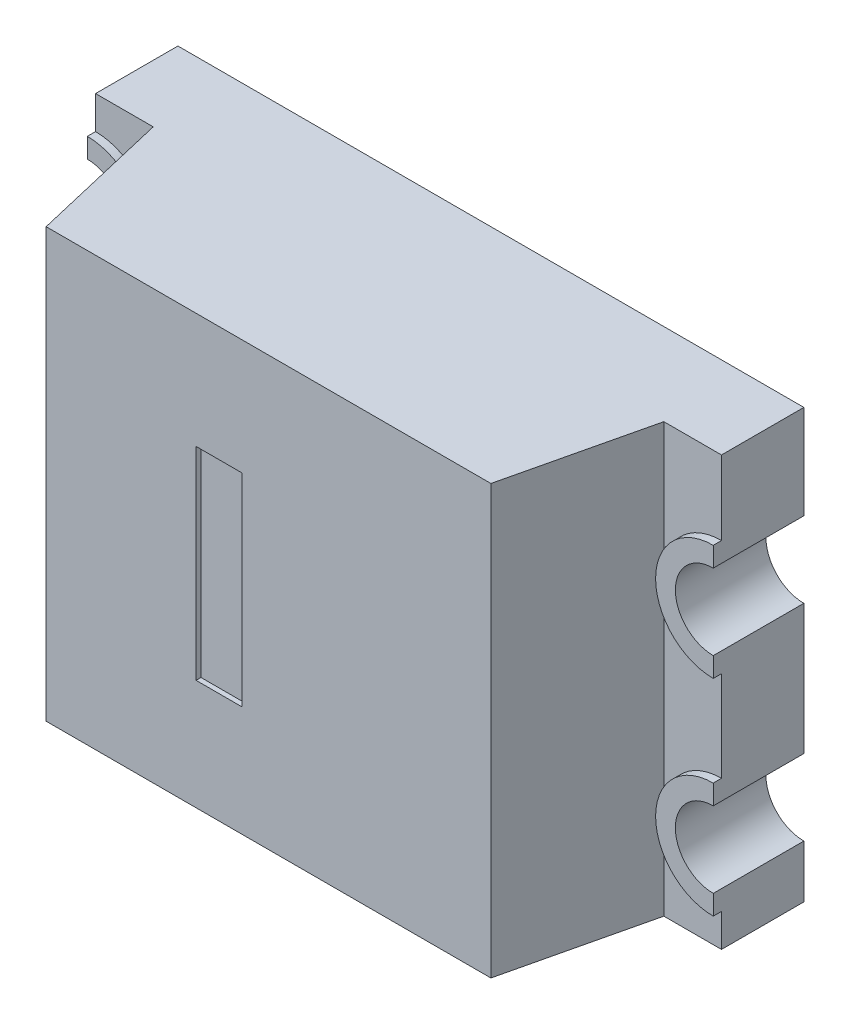
ISO-10303-21;
HEADER;
FILE_DESCRIPTION(('STEP AP214'),'2;1');
FILE_NAME('part.step','',(''),(''),'','','');
FILE_SCHEMA(('AUTOMOTIVE_DESIGN { 1 0 10303 214 1 1 1 1 }'));
ENDSEC;
DATA;
#1=APPLICATION_CONTEXT('core data for automotive mechanical design processes');
#2=APPLICATION_PROTOCOL_DEFINITION('international standard','automotive_design',2000,#1);
#3=PRODUCT_CONTEXT('',#1,'mechanical');
#4=PRODUCT('Part','Part','',(#3));
#5=PRODUCT_RELATED_PRODUCT_CATEGORY('part','',(#4));
#6=PRODUCT_DEFINITION_FORMATION('','',#4);
#7=PRODUCT_DEFINITION_CONTEXT('part definition',#1,'design');
#8=PRODUCT_DEFINITION('design','',#6,#7);
#9=PRODUCT_DEFINITION_SHAPE('','',#8);
#10=(LENGTH_UNIT() NAMED_UNIT(*) SI_UNIT(.MILLI.,.METRE.));
#11=(NAMED_UNIT(*) PLANE_ANGLE_UNIT() SI_UNIT($,.RADIAN.));
#12=(NAMED_UNIT(*) SI_UNIT($,.STERADIAN.) SOLID_ANGLE_UNIT());
#13=UNCERTAINTY_MEASURE_WITH_UNIT(LENGTH_MEASURE(1.E-05),#10,'distance_accuracy_value','');
#14=(GEOMETRIC_REPRESENTATION_CONTEXT(3) GLOBAL_UNCERTAINTY_ASSIGNED_CONTEXT((#13)) GLOBAL_UNIT_ASSIGNED_CONTEXT((#10,
#11,#12)) REPRESENTATION_CONTEXT('',''));
#15=CARTESIAN_POINT('',(0.,0.,0.));
#16=DIRECTION('',(0.,0.,1.));
#17=DIRECTION('',(1.,0.,0.));
#18=AXIS2_PLACEMENT_3D('',#15,#16,#17);
#19=CARTESIAN_POINT('',(-0.44,-0.63,1.32));
#20=DIRECTION('',(0.,0.,1.));
#21=DIRECTION('',(1.,0.,0.));
#22=AXIS2_PLACEMENT_3D('',#19,#20,#21);
#23=PLANE('',#22);
#24=DIRECTION('',(0.,1.,0.));
#25=VECTOR('',#24,1.);
#26=CARTESIAN_POINT('',(-0.44,-0.63,1.32));
#27=LINE('',#26,#25);
#28=CARTESIAN_POINT('',(-0.44,-0.63,1.32));
#29=VERTEX_POINT('',#28);
#30=CARTESIAN_POINT('',(-0.44,0.6,1.32));
#31=VERTEX_POINT('',#30);
#32=EDGE_CURVE('E46',#29,#31,#27,.T.);
#33=ORIENTED_EDGE('',*,*,#32,.F.);
#34=DIRECTION('',(1.,0.,0.));
#35=VECTOR('',#34,1.);
#36=CARTESIAN_POINT('',(-0.44,-0.63,1.32));
#37=LINE('',#36,#35);
#38=CARTESIAN_POINT('',(-0.16,-0.63,1.32));
#39=VERTEX_POINT('',#38);
#40=EDGE_CURVE('E26',#29,#39,#37,.T.);
#41=ORIENTED_EDGE('',*,*,#40,.T.);
#42=DIRECTION('',(0.,1.,0.));
#43=VECTOR('',#42,1.);
#44=CARTESIAN_POINT('',(-0.16,-0.63,1.32));
#45=LINE('',#44,#43);
#46=CARTESIAN_POINT('',(-0.16,0.6,1.32));
#47=VERTEX_POINT('',#46);
#48=EDGE_CURVE('E472',#39,#47,#45,.T.);
#49=ORIENTED_EDGE('',*,*,#48,.T.);
#50=DIRECTION('',(1.,0.,0.));
#51=VECTOR('',#50,1.);
#52=CARTESIAN_POINT('',(-0.44,0.6,1.32));
#53=LINE('',#52,#51);
#54=EDGE_CURVE('E482',#31,#47,#53,.T.);
#55=ORIENTED_EDGE('',*,*,#54,.F.);
#56=EDGE_LOOP('',(#33,#41,#49,#55));
#57=FACE_BOUND('',#56,.T.);
#58=ADVANCED_FACE('F17',(#57),#23,.T.);
#59=CARTESIAN_POINT('',(-1.9,-0.75,0.55));
#60=DIRECTION('',(0.,0.,1.));
#61=DIRECTION('',(1.,0.,0.));
#62=AXIS2_PLACEMENT_3D('',#59,#60,#61);
#63=PLANE('',#62);
#64=CARTESIAN_POINT('',(-1.9,-0.75,0.55));
#65=DIRECTION('',(0.,0.,1.));
#66=DIRECTION('',(-1.,0.,0.));
#67=AXIS2_PLACEMENT_3D('',#64,#65,#66);
#68=CIRCLE('',#67,0.23);
#69=CARTESIAN_POINT('',(-1.9,-0.98,0.55));
#70=VERTEX_POINT('',#69);
#71=CARTESIAN_POINT('',(-1.9,-0.52,0.55));
#72=VERTEX_POINT('',#71);
#73=EDGE_CURVE('E462',#70,#72,#68,.T.);
#74=ORIENTED_EDGE('',*,*,#73,.F.);
#75=DIRECTION('',(0.,-1.,0.));
#76=VECTOR('',#75,1.);
#77=CARTESIAN_POINT('',(-1.9,-0.525,0.55));
#78=LINE('',#77,#76);
#79=CARTESIAN_POINT('',(-1.9,-1.1,0.55));
#80=VERTEX_POINT('',#79);
#81=EDGE_CURVE('E457',#70,#80,#78,.T.);
#82=ORIENTED_EDGE('',*,*,#81,.T.);
#83=CARTESIAN_POINT('',(-1.9,-0.75,0.55));
#84=DIRECTION('',(0.,0.,1.));
#85=DIRECTION('',(-1.,0.,0.));
#86=AXIS2_PLACEMENT_3D('',#83,#84,#85);
#87=CIRCLE('',#86,0.35);
#88=CARTESIAN_POINT('',(-1.9,-0.4,0.55));
#89=VERTEX_POINT('',#88);
#90=EDGE_CURVE('E465',#80,#89,#87,.T.);
#91=ORIENTED_EDGE('',*,*,#90,.T.);
#92=DIRECTION('',(0.,-1.,0.));
#93=VECTOR('',#92,1.);
#94=CARTESIAN_POINT('',(-1.9,-0.525,0.55));
#95=LINE('',#94,#93);
#96=EDGE_CURVE('E398',#89,#72,#95,.T.);
#97=ORIENTED_EDGE('',*,*,#96,.T.);
#98=EDGE_LOOP('',(#74,#82,#91,#97));
#99=FACE_BOUND('',#98,.T.);
#100=ADVANCED_FACE('F520',(#99),#63,.T.);
#101=CARTESIAN_POINT('',(-1.9,0.75,0.5));
#102=DIRECTION('',(0.,0.,1.));
#103=DIRECTION('',(-1.,0.,0.));
#104=AXIS2_PLACEMENT_3D('',#101,#102,#103);
#105=CYLINDRICAL_SURFACE('',#104,0.35);
#106=CARTESIAN_POINT('',(-1.9,0.75,0.55));
#107=DIRECTION('',(0.,0.,1.));
#108=DIRECTION('',(-1.,0.,0.));
#109=AXIS2_PLACEMENT_3D('',#106,#107,#108);
#110=CIRCLE('',#109,0.35);
#111=CARTESIAN_POINT('',(-1.9,0.4,0.55));
#112=VERTEX_POINT('',#111);
#113=CARTESIAN_POINT('',(-1.9,1.1,0.55));
#114=VERTEX_POINT('',#113);
#115=EDGE_CURVE('E11',#112,#114,#110,.T.);
#116=ORIENTED_EDGE('',*,*,#115,.F.);
#117=DIRECTION('',(0.,0.,1.));
#118=VECTOR('',#117,1.);
#119=CARTESIAN_POINT('',(-1.9,0.4,0.5));
#120=LINE('',#119,#118);
#121=CARTESIAN_POINT('',(-1.9,0.4,0.5));
#122=VERTEX_POINT('',#121);
#123=EDGE_CURVE('E332',#122,#112,#120,.T.);
#124=ORIENTED_EDGE('',*,*,#123,.F.);
#125=CARTESIAN_POINT('',(-1.9,0.75,0.5));
#126=DIRECTION('',(0.,0.,1.));
#127=DIRECTION('',(-1.,0.,0.));
#128=AXIS2_PLACEMENT_3D('',#125,#126,#127);
#129=CIRCLE('',#128,0.35);
#130=CARTESIAN_POINT('',(-1.55,0.75,0.5));
#131=VERTEX_POINT('',#130);
#132=EDGE_CURVE('E445',#122,#131,#129,.T.);
#133=ORIENTED_EDGE('',*,*,#132,.T.);
#134=CARTESIAN_POINT('',(-1.9,0.75,0.5));
#135=DIRECTION('',(0.,0.,1.));
#136=DIRECTION('',(-1.,0.,0.));
#137=AXIS2_PLACEMENT_3D('',#134,#135,#136);
#138=CIRCLE('',#137,0.35);
#139=CARTESIAN_POINT('',(-1.9,1.1,0.5));
#140=VERTEX_POINT('',#139);
#141=EDGE_CURVE('E450',#131,#140,#138,.T.);
#142=ORIENTED_EDGE('',*,*,#141,.T.);
#143=DIRECTION('',(0.,0.,1.));
#144=VECTOR('',#143,1.);
#145=CARTESIAN_POINT('',(-1.9,1.1,0.5));
#146=LINE('',#145,#144);
#147=EDGE_CURVE('E325',#140,#114,#146,.T.);
#148=ORIENTED_EDGE('',*,*,#147,.T.);
#149=EDGE_LOOP('',(#116,#124,#133,#142,#148));
#150=FACE_BOUND('',#149,.T.);
#151=ADVANCED_FACE('F19',(#150),#105,.T.);
#152=CARTESIAN_POINT('',(-1.9,0.75,0.55));
#153=DIRECTION('',(0.,0.,1.));
#154=DIRECTION('',(1.,0.,0.));
#155=AXIS2_PLACEMENT_3D('',#152,#153,#154);
#156=PLANE('',#155);
#157=CARTESIAN_POINT('',(-1.9,0.75,0.55));
#158=DIRECTION('',(0.,0.,1.));
#159=DIRECTION('',(-1.,0.,0.));
#160=AXIS2_PLACEMENT_3D('',#157,#158,#159);
#161=CIRCLE('',#160,0.23);
#162=CARTESIAN_POINT('',(-1.9,0.52,0.55));
#163=VERTEX_POINT('',#162);
#164=CARTESIAN_POINT('',(-1.9,0.98,0.55));
#165=VERTEX_POINT('',#164);
#166=EDGE_CURVE('E326',#163,#165,#161,.T.);
#167=ORIENTED_EDGE('',*,*,#166,.F.);
#168=DIRECTION('',(0.,-1.,0.));
#169=VECTOR('',#168,1.);
#170=CARTESIAN_POINT('',(-1.9,0.975,0.55));
#171=LINE('',#170,#169);
#172=EDGE_CURVE('E327',#163,#112,#171,.T.);
#173=ORIENTED_EDGE('',*,*,#172,.T.);
#174=ORIENTED_EDGE('',*,*,#115,.T.);
#175=DIRECTION('',(0.,-1.,0.));
#176=VECTOR('',#175,1.);
#177=CARTESIAN_POINT('',(-1.9,0.975,0.55));
#178=LINE('',#177,#176);
#179=EDGE_CURVE('E322',#114,#165,#178,.T.);
#180=ORIENTED_EDGE('',*,*,#179,.T.);
#181=EDGE_LOOP('',(#167,#173,#174,#180));
#182=FACE_BOUND('',#181,.T.);
#183=ADVANCED_FACE('F517',(#182),#156,.T.);
#184=CARTESIAN_POINT('',(-0.44,-0.63,1.3));
#185=DIRECTION('',(0.,1.,0.));
#186=DIRECTION('',(1.,0.,0.));
#187=AXIS2_PLACEMENT_3D('',#184,#185,#186);
#188=PLANE('',#187);
#189=DIRECTION('',(0.,0.,1.));
#190=VECTOR('',#189,1.);
#191=CARTESIAN_POINT('',(-0.16,-0.63,1.3));
#192=LINE('',#191,#190);
#193=CARTESIAN_POINT('',(-0.16,-0.63,1.35));
#194=VERTEX_POINT('',#193);
#195=EDGE_CURVE('E476',#39,#194,#192,.T.);
#196=ORIENTED_EDGE('',*,*,#195,.F.);
#197=ORIENTED_EDGE('',*,*,#40,.F.);
#198=DIRECTION('',(0.,0.,1.));
#199=VECTOR('',#198,1.);
#200=CARTESIAN_POINT('',(-0.44,-0.63,1.3));
#201=LINE('',#200,#199);
#202=CARTESIAN_POINT('',(-0.44,-0.63,1.35));
#203=VERTEX_POINT('',#202);
#204=EDGE_CURVE('E485',#29,#203,#201,.T.);
#205=ORIENTED_EDGE('',*,*,#204,.T.);
#206=DIRECTION('',(-1.,0.,0.));
#207=VECTOR('',#206,1.);
#208=CARTESIAN_POINT('',(-0.995,-0.63,1.35));
#209=LINE('',#208,#207);
#210=EDGE_CURVE('E404',#194,#203,#209,.T.);
#211=ORIENTED_EDGE('',*,*,#210,.F.);
#212=EDGE_LOOP('',(#196,#197,#205,#211));
#213=FACE_BOUND('',#212,.T.);
#214=ADVANCED_FACE('F495',(#213),#188,.T.);
#215=CARTESIAN_POINT('',(-0.44,-0.63,1.3));
#216=DIRECTION('',(1.,0.,0.));
#217=DIRECTION('',(0.,1.,0.));
#218=AXIS2_PLACEMENT_3D('',#215,#216,#217);
#219=PLANE('',#218);
#220=ORIENTED_EDGE('',*,*,#204,.F.);
#221=ORIENTED_EDGE('',*,*,#32,.T.);
#222=DIRECTION('',(0.,0.,1.));
#223=VECTOR('',#222,1.);
#224=CARTESIAN_POINT('',(-0.44,0.6,1.3));
#225=LINE('',#224,#223);
#226=CARTESIAN_POINT('',(-0.44,0.6,1.35));
#227=VERTEX_POINT('',#226);
#228=EDGE_CURVE('E479',#31,#227,#225,.T.);
#229=ORIENTED_EDGE('',*,*,#228,.T.);
#230=DIRECTION('',(0.,1.,0.));
#231=VECTOR('',#230,1.);
#232=CARTESIAN_POINT('',(-0.44,-0.965,1.35));
#233=LINE('',#232,#231);
#234=EDGE_CURVE('E371',#203,#227,#233,.T.);
#235=ORIENTED_EDGE('',*,*,#234,.F.);
#236=EDGE_LOOP('',(#220,#221,#229,#235));
#237=FACE_BOUND('',#236,.T.);
#238=ADVANCED_FACE('F508',(#237),#219,.T.);
#239=CARTESIAN_POINT('',(-0.44,0.6,1.3));
#240=DIRECTION('',(0.,1.,0.));
#241=DIRECTION('',(1.,0.,0.));
#242=AXIS2_PLACEMENT_3D('',#239,#240,#241);
#243=PLANE('',#242);
#244=DIRECTION('',(-1.,0.,0.));
#245=VECTOR('',#244,1.);
#246=CARTESIAN_POINT('',(-0.995,0.6,1.35));
#247=LINE('',#246,#245);
#248=CARTESIAN_POINT('',(-0.16,0.6,1.35));
#249=VERTEX_POINT('',#248);
#250=EDGE_CURVE('E366',#249,#227,#247,.T.);
#251=ORIENTED_EDGE('',*,*,#250,.T.);
#252=ORIENTED_EDGE('',*,*,#228,.F.);
#253=ORIENTED_EDGE('',*,*,#54,.T.);
#254=DIRECTION('',(0.,0.,1.));
#255=VECTOR('',#254,1.);
#256=CARTESIAN_POINT('',(-0.16,0.6,1.3));
#257=LINE('',#256,#255);
#258=EDGE_CURVE('E469',#47,#249,#257,.T.);
#259=ORIENTED_EDGE('',*,*,#258,.T.);
#260=EDGE_LOOP('',(#251,#252,#253,#259));
#261=FACE_BOUND('',#260,.T.);
#262=ADVANCED_FACE('F502',(#261),#243,.F.);
#263=CARTESIAN_POINT('',(-0.16,-0.63,1.3));
#264=DIRECTION('',(1.,0.,0.));
#265=DIRECTION('',(0.,1.,0.));
#266=AXIS2_PLACEMENT_3D('',#263,#264,#265);
#267=PLANE('',#266);
#268=DIRECTION('',(0.,1.,0.));
#269=VECTOR('',#268,1.);
#270=CARTESIAN_POINT('',(-0.16,-0.965,1.35));
#271=LINE('',#270,#269);
#272=EDGE_CURVE('E407',#194,#249,#271,.T.);
#273=ORIENTED_EDGE('',*,*,#272,.T.);
#274=ORIENTED_EDGE('',*,*,#258,.F.);
#275=ORIENTED_EDGE('',*,*,#48,.F.);
#276=ORIENTED_EDGE('',*,*,#195,.T.);
#277=EDGE_LOOP('',(#273,#274,#275,#276));
#278=FACE_BOUND('',#277,.T.);
#279=ADVANCED_FACE('F499',(#278),#267,.F.);
#280=CARTESIAN_POINT('',(-1.45,-1.3,0.925));
#281=DIRECTION('',(0.973417168333445,0.,-0.229039333726105));
#282=DIRECTION('',(0.,-1.,0.));
#283=AXIS2_PLACEMENT_3D('',#280,#281,#282);
#284=PLANE('',#283);
#285=DIRECTION('',(-0.229039333726105,0.,-0.973417168333445));
#286=VECTOR('',#285,1.);
#287=CARTESIAN_POINT('',(-1.505573770492,-1.3,0.68881147541));
#288=LINE('',#287,#286);
#289=CARTESIAN_POINT('',(-1.35,-1.3,1.35));
#290=VERTEX_POINT('',#289);
#291=CARTESIAN_POINT('',(-1.55,-1.3,0.5));
#292=VERTEX_POINT('',#291);
#293=EDGE_CURVE('E343',#290,#292,#288,.T.);
#294=ORIENTED_EDGE('',*,*,#293,.F.);
#295=DIRECTION('',(0.,1.,0.));
#296=VECTOR('',#295,1.);
#297=CARTESIAN_POINT('',(-1.35,-1.3,1.35));
#298=LINE('',#297,#296);
#299=CARTESIAN_POINT('',(-1.35,1.3,1.35));
#300=VERTEX_POINT('',#299);
#301=EDGE_CURVE('E381',#290,#300,#298,.T.);
#302=ORIENTED_EDGE('',*,*,#301,.T.);
#303=DIRECTION('',(-0.229039333726105,0.,-0.973417168333445));
#304=VECTOR('',#303,1.);
#305=CARTESIAN_POINT('',(-1.505573770492,1.3,0.68881147541));
#306=LINE('',#305,#304);
#307=CARTESIAN_POINT('',(-1.55,1.3,0.5));
#308=VERTEX_POINT('',#307);
#309=EDGE_CURVE('E370',#300,#308,#306,.T.);
#310=ORIENTED_EDGE('',*,*,#309,.T.);
#311=DIRECTION('',(0.,1.,0.));
#312=VECTOR('',#311,1.);
#313=CARTESIAN_POINT('',(-1.55,-1.3,0.5));
#314=LINE('',#313,#312);
#315=EDGE_CURVE('E449',#131,#308,#314,.T.);
#316=ORIENTED_EDGE('',*,*,#315,.F.);
#317=DIRECTION('',(0.,1.,0.));
#318=VECTOR('',#317,1.);
#319=CARTESIAN_POINT('',(-1.55,-1.3,0.5));
#320=LINE('',#319,#318);
#321=CARTESIAN_POINT('',(-1.55,-0.75,0.5));
#322=VERTEX_POINT('',#321);
#323=EDGE_CURVE('E441',#322,#131,#320,.T.);
#324=ORIENTED_EDGE('',*,*,#323,.F.);
#325=DIRECTION('',(0.,1.,0.));
#326=VECTOR('',#325,1.);
#327=CARTESIAN_POINT('',(-1.55,-1.3,0.5));
#328=LINE('',#327,#326);
#329=EDGE_CURVE('E422',#292,#322,#328,.T.);
#330=ORIENTED_EDGE('',*,*,#329,.F.);
#331=EDGE_LOOP('',(#294,#302,#310,#316,#324,#330));
#332=FACE_BOUND('',#331,.T.);
#333=ADVANCED_FACE('F545',(#332),#284,.F.);
#334=CARTESIAN_POINT('',(-1.9,-0.75,0.5));
#335=DIRECTION('',(0.,0.,1.));
#336=DIRECTION('',(-1.,0.,0.));
#337=AXIS2_PLACEMENT_3D('',#334,#335,#336);
#338=CYLINDRICAL_SURFACE('',#337,0.35);
#339=ORIENTED_EDGE('',*,*,#90,.F.);
#340=DIRECTION('',(0.,0.,1.));
#341=VECTOR('',#340,1.);
#342=CARTESIAN_POINT('',(-1.9,-1.1,0.5));
#343=LINE('',#342,#341);
#344=CARTESIAN_POINT('',(-1.9,-1.1,0.5));
#345=VERTEX_POINT('',#344);
#346=EDGE_CURVE('E453',#345,#80,#343,.T.);
#347=ORIENTED_EDGE('',*,*,#346,.F.);
#348=CARTESIAN_POINT('',(-1.9,-0.75,0.5));
#349=DIRECTION('',(0.,0.,1.));
#350=DIRECTION('',(-1.,0.,0.));
#351=AXIS2_PLACEMENT_3D('',#348,#349,#350);
#352=CIRCLE('',#351,0.35);
#353=EDGE_CURVE('E426',#345,#322,#352,.T.);
#354=ORIENTED_EDGE('',*,*,#353,.T.);
#355=CARTESIAN_POINT('',(-1.9,-0.75,0.5));
#356=DIRECTION('',(0.,0.,1.));
#357=DIRECTION('',(-1.,0.,0.));
#358=AXIS2_PLACEMENT_3D('',#355,#356,#357);
#359=CIRCLE('',#358,0.35);
#360=CARTESIAN_POINT('',(-1.9,-0.4,0.5));
#361=VERTEX_POINT('',#360);
#362=EDGE_CURVE('E397',#322,#361,#359,.T.);
#363=ORIENTED_EDGE('',*,*,#362,.T.);
#364=DIRECTION('',(0.,0.,1.));
#365=VECTOR('',#364,1.);
#366=CARTESIAN_POINT('',(-1.9,-0.4,0.5));
#367=LINE('',#366,#365);
#368=EDGE_CURVE('E393',#361,#89,#367,.T.);
#369=ORIENTED_EDGE('',*,*,#368,.T.);
#370=EDGE_LOOP('',(#339,#347,#354,#363,#369));
#371=FACE_BOUND('',#370,.T.);
#372=ADVANCED_FACE('F542',(#371),#338,.T.);
#373=CARTESIAN_POINT('',(-1.9,-0.75,0.));
#374=DIRECTION('',(0.,0.,1.));
#375=DIRECTION('',(-1.,0.,0.));
#376=AXIS2_PLACEMENT_3D('',#373,#374,#375);
#377=CYLINDRICAL_SURFACE('',#376,0.23);
#378=DIRECTION('',(0.,0.,1.));
#379=VECTOR('',#378,1.);
#380=CARTESIAN_POINT('',(-1.9,-0.52,0.));
#381=LINE('',#380,#379);
#382=CARTESIAN_POINT('',(-1.9,-0.52,0.));
#383=VERTEX_POINT('',#382);
#384=EDGE_CURVE('E438',#383,#72,#381,.T.);
#385=ORIENTED_EDGE('',*,*,#384,.F.);
#386=CARTESIAN_POINT('',(-1.9,-0.75,0.));
#387=DIRECTION('',(0.,0.,1.));
#388=DIRECTION('',(-1.,0.,0.));
#389=AXIS2_PLACEMENT_3D('',#386,#387,#388);
#390=CIRCLE('',#389,0.23);
#391=CARTESIAN_POINT('',(-1.9,-0.98,0.));
#392=VERTEX_POINT('',#391);
#393=EDGE_CURVE('E316',#392,#383,#390,.T.);
#394=ORIENTED_EDGE('',*,*,#393,.F.);
#395=DIRECTION('',(0.,0.,1.));
#396=VECTOR('',#395,1.);
#397=CARTESIAN_POINT('',(-1.9,-0.98,0.));
#398=LINE('',#397,#396);
#399=EDGE_CURVE('E461',#392,#70,#398,.T.);
#400=ORIENTED_EDGE('',*,*,#399,.T.);
#401=ORIENTED_EDGE('',*,*,#73,.T.);
#402=EDGE_LOOP('',(#385,#394,#400,#401));
#403=FACE_BOUND('',#402,.T.);
#404=ADVANCED_FACE('F538',(#403),#377,.F.);
#405=CARTESIAN_POINT('',(0.,-0.004528985507246,0.5));
#406=DIRECTION('',(0.,0.,-1.));
#407=DIRECTION('',(0.,-1.,0.));
#408=AXIS2_PLACEMENT_3D('',#405,#406,#407);
#409=PLANE('',#408);
#410=ORIENTED_EDGE('',*,*,#315,.T.);
#411=DIRECTION('',(1.,0.,0.));
#412=VECTOR('',#411,1.);
#413=CARTESIAN_POINT('',(-1.9,1.3,0.5));
#414=LINE('',#413,#412);
#415=CARTESIAN_POINT('',(-1.9,1.3,0.5));
#416=VERTEX_POINT('',#415);
#417=EDGE_CURVE('E310',#416,#308,#414,.T.);
#418=ORIENTED_EDGE('',*,*,#417,.F.);
#419=DIRECTION('',(0.,-1.,0.));
#420=VECTOR('',#419,1.);
#421=CARTESIAN_POINT('',(-1.9,1.3,0.5));
#422=LINE('',#421,#420);
#423=EDGE_CURVE('E399',#416,#140,#422,.T.);
#424=ORIENTED_EDGE('',*,*,#423,.T.);
#425=ORIENTED_EDGE('',*,*,#141,.F.);
#426=EDGE_LOOP('',(#410,#418,#424,#425));
#427=FACE_BOUND('',#426,.T.);
#428=ADVANCED_FACE('F534',(#427),#409,.F.);
#429=CARTESIAN_POINT('',(0.,-0.004528985507246,0.5));
#430=DIRECTION('',(0.,0.,-1.));
#431=DIRECTION('',(0.,-1.,0.));
#432=AXIS2_PLACEMENT_3D('',#429,#430,#431);
#433=PLANE('',#432);
#434=ORIENTED_EDGE('',*,*,#362,.F.);
#435=ORIENTED_EDGE('',*,*,#323,.T.);
#436=ORIENTED_EDGE('',*,*,#132,.F.);
#437=DIRECTION('',(0.,-1.,0.));
#438=VECTOR('',#437,1.);
#439=CARTESIAN_POINT('',(-1.9,0.5,0.5));
#440=LINE('',#439,#438);
#441=EDGE_CURVE('E392',#122,#361,#440,.T.);
#442=ORIENTED_EDGE('',*,*,#441,.T.);
#443=EDGE_LOOP('',(#434,#435,#436,#442));
#444=FACE_BOUND('',#443,.T.);
#445=ADVANCED_FACE('F530',(#444),#433,.F.);
#446=CARTESIAN_POINT('',(-1.9,0.75,0.));
#447=DIRECTION('',(0.,0.,1.));
#448=DIRECTION('',(-1.,0.,0.));
#449=AXIS2_PLACEMENT_3D('',#446,#447,#448);
#450=CYLINDRICAL_SURFACE('',#449,0.23);
#451=DIRECTION('',(0.,0.,1.));
#452=VECTOR('',#451,1.);
#453=CARTESIAN_POINT('',(-1.9,0.98,0.));
#454=LINE('',#453,#452);
#455=CARTESIAN_POINT('',(-1.9,0.98,0.));
#456=VERTEX_POINT('',#455);
#457=EDGE_CURVE('E342',#456,#165,#454,.T.);
#458=ORIENTED_EDGE('',*,*,#457,.F.);
#459=CARTESIAN_POINT('',(-1.9,0.75,0.));
#460=DIRECTION('',(0.,0.,1.));
#461=DIRECTION('',(-1.,0.,0.));
#462=AXIS2_PLACEMENT_3D('',#459,#460,#461);
#463=CIRCLE('',#462,0.23);
#464=CARTESIAN_POINT('',(-1.9,0.52,0.));
#465=VERTEX_POINT('',#464);
#466=EDGE_CURVE('E388',#465,#456,#463,.T.);
#467=ORIENTED_EDGE('',*,*,#466,.F.);
#468=DIRECTION('',(0.,0.,1.));
#469=VECTOR('',#468,1.);
#470=CARTESIAN_POINT('',(-1.9,0.52,0.));
#471=LINE('',#470,#469);
#472=EDGE_CURVE('E331',#465,#163,#471,.T.);
#473=ORIENTED_EDGE('',*,*,#472,.T.);
#474=ORIENTED_EDGE('',*,*,#166,.T.);
#475=EDGE_LOOP('',(#458,#467,#473,#474));
#476=FACE_BOUND('',#475,.T.);
#477=ADVANCED_FACE('F533',(#476),#450,.F.);
#478=CARTESIAN_POINT('',(0.,-0.004528985507246,0.5));
#479=DIRECTION('',(0.,0.,-1.));
#480=DIRECTION('',(0.,-1.,0.));
#481=AXIS2_PLACEMENT_3D('',#478,#479,#480);
#482=PLANE('',#481);
#483=CARTESIAN_POINT('',(1.9,0.5,0.5));
#484=DIRECTION('',(0.,0.,1.));
#485=DIRECTION('',(1.,0.,0.));
#486=AXIS2_PLACEMENT_3D('',#483,#484,#485);
#487=CIRCLE('',#486,0.35);
#488=CARTESIAN_POINT('',(1.9,0.85,0.5));
#489=VERTEX_POINT('',#488);
#490=CARTESIAN_POINT('',(1.55,0.5,0.5));
#491=VERTEX_POINT('',#490);
#492=EDGE_CURVE('E286',#489,#491,#487,.T.);
#493=ORIENTED_EDGE('',*,*,#492,.F.);
#494=DIRECTION('',(0.,-1.,0.));
#495=VECTOR('',#494,1.);
#496=CARTESIAN_POINT('',(1.9,1.3,0.5));
#497=LINE('',#496,#495);
#498=CARTESIAN_POINT('',(1.9,1.3,0.5));
#499=VERTEX_POINT('',#498);
#500=EDGE_CURVE('E279',#499,#489,#497,.T.);
#501=ORIENTED_EDGE('',*,*,#500,.F.);
#502=DIRECTION('',(1.,0.,0.));
#503=VECTOR('',#502,1.);
#504=CARTESIAN_POINT('',(-1.9,1.3,0.5));
#505=LINE('',#504,#503);
#506=CARTESIAN_POINT('',(1.55,1.3,0.5));
#507=VERTEX_POINT('',#506);
#508=EDGE_CURVE('E284',#507,#499,#505,.T.);
#509=ORIENTED_EDGE('',*,*,#508,.F.);
#510=DIRECTION('',(0.,1.,0.));
#511=VECTOR('',#510,1.);
#512=CARTESIAN_POINT('',(1.55,-1.3,0.5));
#513=LINE('',#512,#511);
#514=EDGE_CURVE('E362',#491,#507,#513,.T.);
#515=ORIENTED_EDGE('',*,*,#514,.F.);
#516=EDGE_LOOP('',(#493,#501,#509,#515));
#517=FACE_BOUND('',#516,.T.);
#518=ADVANCED_FACE('F281',(#517),#482,.F.);
#519=CARTESIAN_POINT('',(-1.55,-1.3,1.35));
#520=DIRECTION('',(0.,0.,1.));
#521=DIRECTION('',(1.,0.,0.));
#522=AXIS2_PLACEMENT_3D('',#519,#520,#521);
#523=PLANE('',#522);
#524=ORIENTED_EDGE('',*,*,#272,.F.);
#525=ORIENTED_EDGE('',*,*,#210,.T.);
#526=ORIENTED_EDGE('',*,*,#234,.T.);
#527=ORIENTED_EDGE('',*,*,#250,.F.);
#528=EDGE_LOOP('',(#524,#525,#526,#527));
#529=FACE_BOUND('',#528,.T.);
#530=DIRECTION('',(1.,0.,0.));
#531=VECTOR('',#530,1.);
#532=CARTESIAN_POINT('',(-1.55,1.3,1.35));
#533=LINE('',#532,#531);
#534=CARTESIAN_POINT('',(1.35,1.3,1.35));
#535=VERTEX_POINT('',#534);
#536=EDGE_CURVE('E346',#300,#535,#533,.T.);
#537=ORIENTED_EDGE('',*,*,#536,.F.);
#538=ORIENTED_EDGE('',*,*,#301,.F.);
#539=DIRECTION('',(1.,0.,0.));
#540=VECTOR('',#539,1.);
#541=CARTESIAN_POINT('',(-1.55,-1.3,1.35));
#542=LINE('',#541,#540);
#543=CARTESIAN_POINT('',(1.35,-1.3,1.35));
#544=VERTEX_POINT('',#543);
#545=EDGE_CURVE('E347',#290,#544,#542,.T.);
#546=ORIENTED_EDGE('',*,*,#545,.T.);
#547=DIRECTION('',(0.,1.,0.));
#548=VECTOR('',#547,1.);
#549=CARTESIAN_POINT('',(1.35,-1.3,1.35));
#550=LINE('',#549,#548);
#551=EDGE_CURVE('E374',#544,#535,#550,.T.);
#552=ORIENTED_EDGE('',*,*,#551,.T.);
#553=EDGE_LOOP('',(#537,#538,#546,#552));
#554=FACE_BOUND('',#553,.T.);
#555=ADVANCED_FACE('F505',(#529,#554),#523,.T.);
#556=CARTESIAN_POINT('',(0.,-0.004528985507246,0.5));
#557=DIRECTION('',(0.,0.,-1.));
#558=DIRECTION('',(0.,-1.,0.));
#559=AXIS2_PLACEMENT_3D('',#556,#557,#558);
#560=PLANE('',#559);
#561=DIRECTION('',(0.,-1.,0.));
#562=VECTOR('',#561,1.);
#563=CARTESIAN_POINT('',(-1.9,-1.,0.5));
#564=LINE('',#563,#562);
#565=CARTESIAN_POINT('',(-1.9,-1.3,0.5));
#566=VERTEX_POINT('',#565);
#567=EDGE_CURVE('E292',#345,#566,#564,.T.);
#568=ORIENTED_EDGE('',*,*,#567,.T.);
#569=DIRECTION('',(1.,0.,0.));
#570=VECTOR('',#569,1.);
#571=CARTESIAN_POINT('',(-1.9,-1.3,0.5));
#572=LINE('',#571,#570);
#573=EDGE_CURVE('E350',#566,#292,#572,.T.);
#574=ORIENTED_EDGE('',*,*,#573,.T.);
#575=ORIENTED_EDGE('',*,*,#329,.T.);
#576=ORIENTED_EDGE('',*,*,#353,.F.);
#577=EDGE_LOOP('',(#568,#574,#575,#576));
#578=FACE_BOUND('',#577,.T.);
#579=ADVANCED_FACE('F597',(#578),#560,.F.);
#580=CARTESIAN_POINT('',(1.9,0.5,0.55));
#581=DIRECTION('',(0.,0.,1.));
#582=DIRECTION('',(1.,0.,0.));
#583=AXIS2_PLACEMENT_3D('',#580,#581,#582);
#584=PLANE('',#583);
#585=DIRECTION('',(0.,1.,0.));
#586=VECTOR('',#585,1.);
#587=CARTESIAN_POINT('',(1.9,0.275,0.55));
#588=LINE('',#587,#586);
#589=CARTESIAN_POINT('',(1.9,0.73,0.55));
#590=VERTEX_POINT('',#589);
#591=CARTESIAN_POINT('',(1.9,0.85,0.55));
#592=VERTEX_POINT('',#591);
#593=EDGE_CURVE('E419',#590,#592,#588,.T.);
#594=ORIENTED_EDGE('',*,*,#593,.T.);
#595=CARTESIAN_POINT('',(1.9,0.5,0.55));
#596=DIRECTION('',(0.,0.,1.));
#597=DIRECTION('',(1.,0.,0.));
#598=AXIS2_PLACEMENT_3D('',#595,#596,#597);
#599=CIRCLE('',#598,0.35);
#600=CARTESIAN_POINT('',(1.9,0.15,0.55));
#601=VERTEX_POINT('',#600);
#602=EDGE_CURVE('E378',#592,#601,#599,.T.);
#603=ORIENTED_EDGE('',*,*,#602,.T.);
#604=DIRECTION('',(0.,1.,0.));
#605=VECTOR('',#604,1.);
#606=CARTESIAN_POINT('',(1.9,0.275,0.55));
#607=LINE('',#606,#605);
#608=CARTESIAN_POINT('',(1.9,0.27,0.55));
#609=VERTEX_POINT('',#608);
#610=EDGE_CURVE('E333',#601,#609,#607,.T.);
#611=ORIENTED_EDGE('',*,*,#610,.T.);
#612=CARTESIAN_POINT('',(1.9,0.5,0.55));
#613=DIRECTION('',(0.,0.,1.));
#614=DIRECTION('',(1.,0.,0.));
#615=AXIS2_PLACEMENT_3D('',#612,#613,#614);
#616=CIRCLE('',#615,0.23);
#617=EDGE_CURVE('E416',#590,#609,#616,.T.);
#618=ORIENTED_EDGE('',*,*,#617,.F.);
#619=EDGE_LOOP('',(#594,#603,#611,#618));
#620=FACE_BOUND('',#619,.T.);
#621=ADVANCED_FACE('F603',(#620),#584,.T.);
#622=CARTESIAN_POINT('',(1.9,0.5,0.));
#623=DIRECTION('',(0.,0.,1.));
#624=DIRECTION('',(1.,0.,0.));
#625=AXIS2_PLACEMENT_3D('',#622,#623,#624);
#626=CYLINDRICAL_SURFACE('',#625,0.23);
#627=DIRECTION('',(0.,0.,1.));
#628=VECTOR('',#627,1.);
#629=CARTESIAN_POINT('',(1.9,0.27,0.));
#630=LINE('',#629,#628);
#631=CARTESIAN_POINT('',(1.9,0.27,0.));
#632=VERTEX_POINT('',#631);
#633=EDGE_CURVE('E338',#632,#609,#630,.T.);
#634=ORIENTED_EDGE('',*,*,#633,.F.);
#635=CARTESIAN_POINT('',(1.9,0.5,0.));
#636=DIRECTION('',(0.,0.,1.));
#637=DIRECTION('',(1.,0.,0.));
#638=AXIS2_PLACEMENT_3D('',#635,#636,#637);
#639=CIRCLE('',#638,0.23);
#640=CARTESIAN_POINT('',(1.9,0.73,0.));
#641=VERTEX_POINT('',#640);
#642=EDGE_CURVE('E291',#641,#632,#639,.T.);
#643=ORIENTED_EDGE('',*,*,#642,.F.);
#644=DIRECTION('',(0.,0.,1.));
#645=VECTOR('',#644,1.);
#646=CARTESIAN_POINT('',(1.9,0.73,0.));
#647=LINE('',#646,#645);
#648=EDGE_CURVE('E415',#641,#590,#647,.T.);
#649=ORIENTED_EDGE('',*,*,#648,.T.);
#650=ORIENTED_EDGE('',*,*,#617,.T.);
#651=EDGE_LOOP('',(#634,#643,#649,#650));
#652=FACE_BOUND('',#651,.T.);
#653=ADVANCED_FACE('F611',(#652),#626,.F.);
#654=CARTESIAN_POINT('',(1.9,1.3,0.));
#655=DIRECTION('',(1.,0.,0.));
#656=DIRECTION('',(0.,1.,0.));
#657=AXIS2_PLACEMENT_3D('',#654,#655,#656);
#658=PLANE('',#657);
#659=ORIENTED_EDGE('',*,*,#500,.T.);
#660=DIRECTION('',(0.,0.,1.));
#661=VECTOR('',#660,1.);
#662=CARTESIAN_POINT('',(1.9,0.85,0.5));
#663=LINE('',#662,#661);
#664=EDGE_CURVE('E385',#489,#592,#663,.T.);
#665=ORIENTED_EDGE('',*,*,#664,.T.);
#666=ORIENTED_EDGE('',*,*,#593,.F.);
#667=ORIENTED_EDGE('',*,*,#648,.F.);
#668=DIRECTION('',(0.,-1.,0.));
#669=VECTOR('',#668,1.);
#670=CARTESIAN_POINT('',(1.9,1.3,0.));
#671=LINE('',#670,#669);
#672=CARTESIAN_POINT('',(1.9,1.3,0.));
#673=VERTEX_POINT('',#672);
#674=EDGE_CURVE('E298',#673,#641,#671,.T.);
#675=ORIENTED_EDGE('',*,*,#674,.F.);
#676=DIRECTION('',(0.,0.,1.));
#677=VECTOR('',#676,1.);
#678=CARTESIAN_POINT('',(1.9,1.3,0.));
#679=LINE('',#678,#677);
#680=EDGE_CURVE('E295',#673,#499,#679,.T.);
#681=ORIENTED_EDGE('',*,*,#680,.T.);
#682=EDGE_LOOP('',(#659,#665,#666,#667,#675,#681));
#683=FACE_BOUND('',#682,.T.);
#684=ADVANCED_FACE('F296',(#683),#658,.T.);
#685=CARTESIAN_POINT('',(-1.9,-1.,0.));
#686=DIRECTION('',(1.,0.,0.));
#687=DIRECTION('',(0.,1.,0.));
#688=AXIS2_PLACEMENT_3D('',#685,#686,#687);
#689=PLANE('',#688);
#690=ORIENTED_EDGE('',*,*,#567,.F.);
#691=ORIENTED_EDGE('',*,*,#346,.T.);
#692=ORIENTED_EDGE('',*,*,#81,.F.);
#693=ORIENTED_EDGE('',*,*,#399,.F.);
#694=DIRECTION('',(0.,-1.,0.));
#695=VECTOR('',#694,1.);
#696=CARTESIAN_POINT('',(-1.9,-1.,0.));
#697=LINE('',#696,#695);
#698=CARTESIAN_POINT('',(-1.9,-1.3,0.));
#699=VERTEX_POINT('',#698);
#700=EDGE_CURVE('E320',#392,#699,#697,.T.);
#701=ORIENTED_EDGE('',*,*,#700,.T.);
#702=DIRECTION('',(0.,0.,1.));
#703=VECTOR('',#702,1.);
#704=CARTESIAN_POINT('',(-1.9,-1.3,0.));
#705=LINE('',#704,#703);
#706=EDGE_CURVE('E354',#699,#566,#705,.T.);
#707=ORIENTED_EDGE('',*,*,#706,.T.);
#708=EDGE_LOOP('',(#690,#691,#692,#693,#701,#707));
#709=FACE_BOUND('',#708,.T.);
#710=ADVANCED_FACE('F628',(#709),#689,.F.);
#711=CARTESIAN_POINT('',(-1.9,1.3,0.));
#712=DIRECTION('',(0.,1.,0.));
#713=DIRECTION('',(1.,0.,0.));
#714=AXIS2_PLACEMENT_3D('',#711,#712,#713);
#715=PLANE('',#714);
#716=ORIENTED_EDGE('',*,*,#417,.T.);
#717=ORIENTED_EDGE('',*,*,#309,.F.);
#718=ORIENTED_EDGE('',*,*,#536,.T.);
#719=DIRECTION('',(-0.229039333726105,0.,0.973417168333445));
#720=VECTOR('',#719,1.);
#721=CARTESIAN_POINT('',(1.424262295082,1.3,1.034385245902));
#722=LINE('',#721,#720);
#723=EDGE_CURVE('E307',#507,#535,#722,.T.);
#724=ORIENTED_EDGE('',*,*,#723,.F.);
#725=ORIENTED_EDGE('',*,*,#508,.T.);
#726=ORIENTED_EDGE('',*,*,#680,.F.);
#727=DIRECTION('',(1.,0.,0.));
#728=VECTOR('',#727,1.);
#729=CARTESIAN_POINT('',(-1.9,1.3,0.));
#730=LINE('',#729,#728);
#731=CARTESIAN_POINT('',(-1.9,1.3,0.));
#732=VERTEX_POINT('',#731);
#733=EDGE_CURVE('E1088',#732,#673,#730,.T.);
#734=ORIENTED_EDGE('',*,*,#733,.F.);
#735=DIRECTION('',(0.,0.,1.));
#736=VECTOR('',#735,1.);
#737=CARTESIAN_POINT('',(-1.9,1.3,0.));
#738=LINE('',#737,#736);
#739=EDGE_CURVE('E402',#732,#416,#738,.T.);
#740=ORIENTED_EDGE('',*,*,#739,.T.);
#741=EDGE_LOOP('',(#716,#717,#718,#724,#725,#726,#734,#740));
#742=FACE_BOUND('',#741,.T.);
#743=ADVANCED_FACE('F305',(#742),#715,.T.);
#744=CARTESIAN_POINT('',(-1.9,1.3,0.));
#745=DIRECTION('',(1.,0.,0.));
#746=DIRECTION('',(0.,1.,0.));
#747=AXIS2_PLACEMENT_3D('',#744,#745,#746);
#748=PLANE('',#747);
#749=DIRECTION('',(0.,-1.,0.));
#750=VECTOR('',#749,1.);
#751=CARTESIAN_POINT('',(-1.9,1.3,0.));
#752=LINE('',#751,#750);
#753=EDGE_CURVE('E1092',#732,#456,#752,.T.);
#754=ORIENTED_EDGE('',*,*,#753,.T.);
#755=ORIENTED_EDGE('',*,*,#457,.T.);
#756=ORIENTED_EDGE('',*,*,#179,.F.);
#757=ORIENTED_EDGE('',*,*,#147,.F.);
#758=ORIENTED_EDGE('',*,*,#423,.F.);
#759=ORIENTED_EDGE('',*,*,#739,.F.);
#760=EDGE_LOOP('',(#754,#755,#756,#757,#758,#759));
#761=FACE_BOUND('',#760,.T.);
#762=ADVANCED_FACE('F627',(#761),#748,.F.);
#763=CARTESIAN_POINT('',(-1.9,0.5,0.));
#764=DIRECTION('',(1.,0.,0.));
#765=DIRECTION('',(0.,1.,0.));
#766=AXIS2_PLACEMENT_3D('',#763,#764,#765);
#767=PLANE('',#766);
#768=ORIENTED_EDGE('',*,*,#441,.F.);
#769=ORIENTED_EDGE('',*,*,#123,.T.);
#770=ORIENTED_EDGE('',*,*,#172,.F.);
#771=ORIENTED_EDGE('',*,*,#472,.F.);
#772=DIRECTION('',(0.,-1.,0.));
#773=VECTOR('',#772,1.);
#774=CARTESIAN_POINT('',(-1.9,0.5,0.));
#775=LINE('',#774,#773);
#776=EDGE_CURVE('E1070',#465,#383,#775,.T.);
#777=ORIENTED_EDGE('',*,*,#776,.T.);
#778=ORIENTED_EDGE('',*,*,#384,.T.);
#779=ORIENTED_EDGE('',*,*,#96,.F.);
#780=ORIENTED_EDGE('',*,*,#368,.F.);
#781=EDGE_LOOP('',(#768,#769,#770,#771,#777,#778,#779,#780));
#782=FACE_BOUND('',#781,.T.);
#783=ADVANCED_FACE('F639',(#782),#767,.F.);
#784=CARTESIAN_POINT('',(1.9,0.5,0.5));
#785=DIRECTION('',(0.,0.,1.));
#786=DIRECTION('',(1.,0.,0.));
#787=AXIS2_PLACEMENT_3D('',#784,#785,#786);
#788=CYLINDRICAL_SURFACE('',#787,0.35);
#789=ORIENTED_EDGE('',*,*,#602,.F.);
#790=ORIENTED_EDGE('',*,*,#664,.F.);
#791=ORIENTED_EDGE('',*,*,#492,.T.);
#792=CARTESIAN_POINT('',(1.9,0.5,0.5));
#793=DIRECTION('',(0.,0.,1.));
#794=DIRECTION('',(1.,0.,0.));
#795=AXIS2_PLACEMENT_3D('',#792,#793,#794);
#796=CIRCLE('',#795,0.35);
#797=CARTESIAN_POINT('',(1.9,0.15,0.5));
#798=VERTEX_POINT('',#797);
#799=EDGE_CURVE('E1137',#491,#798,#796,.T.);
#800=ORIENTED_EDGE('',*,*,#799,.T.);
#801=DIRECTION('',(0.,0.,1.));
#802=VECTOR('',#801,1.);
#803=CARTESIAN_POINT('',(1.9,0.15,0.5));
#804=LINE('',#803,#802);
#805=EDGE_CURVE('E337',#798,#601,#804,.T.);
#806=ORIENTED_EDGE('',*,*,#805,.T.);
#807=EDGE_LOOP('',(#789,#790,#791,#800,#806));
#808=FACE_BOUND('',#807,.T.);
#809=ADVANCED_FACE('F634',(#808),#788,.T.);
#810=CARTESIAN_POINT('',(1.45,-1.3,0.925));
#811=DIRECTION('',(0.973417168333445,0.,0.229039333726105));
#812=DIRECTION('',(0.,-1.,0.));
#813=AXIS2_PLACEMENT_3D('',#810,#811,#812);
#814=PLANE('',#813);
#815=DIRECTION('',(-0.229039333726105,0.,0.973417168333445));
#816=VECTOR('',#815,1.);
#817=CARTESIAN_POINT('',(1.424262295082,-1.3,1.034385245902));
#818=LINE('',#817,#816);
#819=CARTESIAN_POINT('',(1.55,-1.3,0.5));
#820=VERTEX_POINT('',#819);
#821=EDGE_CURVE('E358',#820,#544,#818,.T.);
#822=ORIENTED_EDGE('',*,*,#821,.F.);
#823=DIRECTION('',(0.,1.,0.));
#824=VECTOR('',#823,1.);
#825=CARTESIAN_POINT('',(1.55,-1.3,0.5));
#826=LINE('',#825,#824);
#827=CARTESIAN_POINT('',(1.55,-0.75,0.5));
#828=VERTEX_POINT('',#827);
#829=EDGE_CURVE('E1139',#820,#828,#826,.T.);
#830=ORIENTED_EDGE('',*,*,#829,.T.);
#831=DIRECTION('',(0.,1.,0.));
#832=VECTOR('',#831,1.);
#833=CARTESIAN_POINT('',(1.55,-1.3,0.5));
#834=LINE('',#833,#832);
#835=EDGE_CURVE('E1142',#828,#491,#834,.T.);
#836=ORIENTED_EDGE('',*,*,#835,.T.);
#837=ORIENTED_EDGE('',*,*,#514,.T.);
#838=ORIENTED_EDGE('',*,*,#723,.T.);
#839=ORIENTED_EDGE('',*,*,#551,.F.);
#840=EDGE_LOOP('',(#822,#830,#836,#837,#838,#839));
#841=FACE_BOUND('',#840,.T.);
#842=ADVANCED_FACE('F638',(#841),#814,.T.);
#843=CARTESIAN_POINT('',(-1.9,-1.3,0.));
#844=DIRECTION('',(0.,1.,0.));
#845=DIRECTION('',(1.,0.,0.));
#846=AXIS2_PLACEMENT_3D('',#843,#844,#845);
#847=PLANE('',#846);
#848=DIRECTION('',(1.,0.,0.));
#849=VECTOR('',#848,1.);
#850=CARTESIAN_POINT('',(-1.9,-1.3,0.5));
#851=LINE('',#850,#849);
#852=CARTESIAN_POINT('',(1.9,-1.3,0.5));
#853=VERTEX_POINT('',#852);
#854=EDGE_CURVE('E1095',#820,#853,#851,.T.);
#855=ORIENTED_EDGE('',*,*,#854,.F.);
#856=ORIENTED_EDGE('',*,*,#821,.T.);
#857=ORIENTED_EDGE('',*,*,#545,.F.);
#858=ORIENTED_EDGE('',*,*,#293,.T.);
#859=ORIENTED_EDGE('',*,*,#573,.F.);
#860=ORIENTED_EDGE('',*,*,#706,.F.);
#861=DIRECTION('',(1.,0.,0.));
#862=VECTOR('',#861,1.);
#863=CARTESIAN_POINT('',(-1.9,-1.3,0.));
#864=LINE('',#863,#862);
#865=CARTESIAN_POINT('',(1.9,-1.3,0.));
#866=VERTEX_POINT('',#865);
#867=EDGE_CURVE('E1085',#699,#866,#864,.T.);
#868=ORIENTED_EDGE('',*,*,#867,.T.);
#869=DIRECTION('',(0.,0.,1.));
#870=VECTOR('',#869,1.);
#871=CARTESIAN_POINT('',(1.9,-1.3,0.));
#872=LINE('',#871,#870);
#873=EDGE_CURVE('E1133',#866,#853,#872,.T.);
#874=ORIENTED_EDGE('',*,*,#873,.T.);
#875=EDGE_LOOP('',(#855,#856,#857,#858,#859,#860,#868,#874));
#876=FACE_BOUND('',#875,.T.);
#877=ADVANCED_FACE('F648',(#876),#847,.F.);
#878=CARTESIAN_POINT('',(0.,-0.004528985507246,0.5));
#879=DIRECTION('',(0.,0.,-1.));
#880=DIRECTION('',(0.,-1.,0.));
#881=AXIS2_PLACEMENT_3D('',#878,#879,#880);
#882=PLANE('',#881);
#883=DIRECTION('',(0.,1.,0.));
#884=VECTOR('',#883,1.);
#885=CARTESIAN_POINT('',(1.9,-1.3,0.5));
#886=LINE('',#885,#884);
#887=CARTESIAN_POINT('',(1.9,-1.1,0.5));
#888=VERTEX_POINT('',#887);
#889=EDGE_CURVE('E1125',#853,#888,#886,.T.);
#890=ORIENTED_EDGE('',*,*,#889,.T.);
#891=CARTESIAN_POINT('',(1.9,-0.75,0.5));
#892=DIRECTION('',(0.,0.,1.));
#893=DIRECTION('',(1.,0.,0.));
#894=AXIS2_PLACEMENT_3D('',#891,#892,#893);
#895=CIRCLE('',#894,0.35);
#896=EDGE_CURVE('E1100',#828,#888,#895,.T.);
#897=ORIENTED_EDGE('',*,*,#896,.F.);
#898=ORIENTED_EDGE('',*,*,#829,.F.);
#899=ORIENTED_EDGE('',*,*,#854,.T.);
#900=EDGE_LOOP('',(#890,#897,#898,#899));
#901=FACE_BOUND('',#900,.T.);
#902=ADVANCED_FACE('F656',(#901),#882,.F.);
#903=CARTESIAN_POINT('',(0.,-0.004528985507246,0.5));
#904=DIRECTION('',(0.,0.,-1.));
#905=DIRECTION('',(0.,-1.,0.));
#906=AXIS2_PLACEMENT_3D('',#903,#904,#905);
#907=PLANE('',#906);
#908=CARTESIAN_POINT('',(1.9,-0.75,0.5));
#909=DIRECTION('',(0.,0.,1.));
#910=DIRECTION('',(1.,0.,0.));
#911=AXIS2_PLACEMENT_3D('',#908,#909,#910);
#912=CIRCLE('',#911,0.35);
#913=CARTESIAN_POINT('',(1.9,-0.4,0.5));
#914=VERTEX_POINT('',#913);
#915=EDGE_CURVE('E1193',#914,#828,#912,.T.);
#916=ORIENTED_EDGE('',*,*,#915,.F.);
#917=DIRECTION('',(0.,-1.,0.));
#918=VECTOR('',#917,1.);
#919=CARTESIAN_POINT('',(1.9,0.25,0.5));
#920=LINE('',#919,#918);
#921=EDGE_CURVE('E1106',#798,#914,#920,.T.);
#922=ORIENTED_EDGE('',*,*,#921,.F.);
#923=ORIENTED_EDGE('',*,*,#799,.F.);
#924=ORIENTED_EDGE('',*,*,#835,.F.);
#925=EDGE_LOOP('',(#916,#922,#923,#924));
#926=FACE_BOUND('',#925,.T.);
#927=ADVANCED_FACE('F664',(#926),#907,.F.);
#928=CARTESIAN_POINT('',(1.9,-0.75,0.));
#929=DIRECTION('',(0.,0.,1.));
#930=DIRECTION('',(1.,0.,0.));
#931=AXIS2_PLACEMENT_3D('',#928,#929,#930);
#932=CYLINDRICAL_SURFACE('',#931,0.23);
#933=DIRECTION('',(0.,0.,1.));
#934=VECTOR('',#933,1.);
#935=CARTESIAN_POINT('',(1.9,-0.98,0.));
#936=LINE('',#935,#934);
#937=CARTESIAN_POINT('',(1.9,-0.98,0.));
#938=VERTEX_POINT('',#937);
#939=CARTESIAN_POINT('',(1.9,-0.98,0.55));
#940=VERTEX_POINT('',#939);
#941=EDGE_CURVE('E1172',#938,#940,#936,.T.);
#942=ORIENTED_EDGE('',*,*,#941,.F.);
#943=CARTESIAN_POINT('',(1.9,-0.75,0.));
#944=DIRECTION('',(0.,0.,1.));
#945=DIRECTION('',(1.,0.,0.));
#946=AXIS2_PLACEMENT_3D('',#943,#944,#945);
#947=CIRCLE('',#946,0.23);
#948=CARTESIAN_POINT('',(1.9,-0.52,0.));
#949=VERTEX_POINT('',#948);
#950=EDGE_CURVE('E1103',#949,#938,#947,.T.);
#951=ORIENTED_EDGE('',*,*,#950,.F.);
#952=DIRECTION('',(0.,0.,1.));
#953=VECTOR('',#952,1.);
#954=CARTESIAN_POINT('',(1.9,-0.52,0.));
#955=LINE('',#954,#953);
#956=CARTESIAN_POINT('',(1.9,-0.52,0.55));
#957=VERTEX_POINT('',#956);
#958=EDGE_CURVE('E1174',#949,#957,#955,.T.);
#959=ORIENTED_EDGE('',*,*,#958,.T.);
#960=CARTESIAN_POINT('',(1.9,-0.75,0.55));
#961=DIRECTION('',(0.,0.,1.));
#962=DIRECTION('',(1.,0.,0.));
#963=AXIS2_PLACEMENT_3D('',#960,#961,#962);
#964=CIRCLE('',#963,0.23);
#965=EDGE_CURVE('E1178',#957,#940,#964,.T.);
#966=ORIENTED_EDGE('',*,*,#965,.T.);
#967=EDGE_LOOP('',(#942,#951,#959,#966));
#968=FACE_BOUND('',#967,.T.);
#969=ADVANCED_FACE('F672',(#968),#932,.F.);
#970=CARTESIAN_POINT('',(1.9,-0.75,0.));
#971=DIRECTION('',(0.,0.,1.));
#972=DIRECTION('',(1.,0.,0.));
#973=AXIS2_PLACEMENT_3D('',#970,#971,#972);
#974=PLANE('',#973);
#975=ORIENTED_EDGE('',*,*,#950,.T.);
#976=DIRECTION('',(0.,1.,0.));
#977=VECTOR('',#976,1.);
#978=CARTESIAN_POINT('',(1.9,-1.2,0.));
#979=LINE('',#978,#977);
#980=EDGE_CURVE('E1158',#866,#938,#979,.T.);
#981=ORIENTED_EDGE('',*,*,#980,.F.);
#982=ORIENTED_EDGE('',*,*,#867,.F.);
#983=ORIENTED_EDGE('',*,*,#700,.F.);
#984=ORIENTED_EDGE('',*,*,#393,.T.);
#985=ORIENTED_EDGE('',*,*,#776,.F.);
#986=ORIENTED_EDGE('',*,*,#466,.T.);
#987=ORIENTED_EDGE('',*,*,#753,.F.);
#988=ORIENTED_EDGE('',*,*,#733,.T.);
#989=ORIENTED_EDGE('',*,*,#674,.T.);
#990=ORIENTED_EDGE('',*,*,#642,.T.);
#991=DIRECTION('',(0.,1.,0.));
#992=VECTOR('',#991,1.);
#993=CARTESIAN_POINT('',(1.9,-1.2,0.));
#994=LINE('',#993,#992);
#995=EDGE_CURVE('E1223',#949,#632,#994,.T.);
#996=ORIENTED_EDGE('',*,*,#995,.F.);
#997=EDGE_LOOP('',(#975,#981,#982,#983,#984,#985,#986,#987,#988,#989,#990,#996));
#998=FACE_BOUND('',#997,.T.);
#999=ADVANCED_FACE('F680',(#998),#974,.F.);
#1000=CARTESIAN_POINT('',(1.9,-0.75,0.5));
#1001=DIRECTION('',(0.,0.,1.));
#1002=DIRECTION('',(1.,0.,0.));
#1003=AXIS2_PLACEMENT_3D('',#1000,#1001,#1002);
#1004=CYLINDRICAL_SURFACE('',#1003,0.35);
#1005=CARTESIAN_POINT('',(1.9,-0.75,0.55));
#1006=DIRECTION('',(0.,0.,1.));
#1007=DIRECTION('',(1.,0.,0.));
#1008=AXIS2_PLACEMENT_3D('',#1005,#1006,#1007);
#1009=CIRCLE('',#1008,0.35);
#1010=CARTESIAN_POINT('',(1.9,-0.4,0.55));
#1011=VERTEX_POINT('',#1010);
#1012=CARTESIAN_POINT('',(1.9,-1.1,0.55));
#1013=VERTEX_POINT('',#1012);
#1014=EDGE_CURVE('E1217',#1011,#1013,#1009,.T.);
#1015=ORIENTED_EDGE('',*,*,#1014,.F.);
#1016=DIRECTION('',(0.,0.,1.));
#1017=VECTOR('',#1016,1.);
#1018=CARTESIAN_POINT('',(1.9,-0.4,0.5));
#1019=LINE('',#1018,#1017);
#1020=EDGE_CURVE('E1179',#914,#1011,#1019,.T.);
#1021=ORIENTED_EDGE('',*,*,#1020,.F.);
#1022=ORIENTED_EDGE('',*,*,#915,.T.);
#1023=ORIENTED_EDGE('',*,*,#896,.T.);
#1024=DIRECTION('',(0.,0.,1.));
#1025=VECTOR('',#1024,1.);
#1026=CARTESIAN_POINT('',(1.9,-1.1,0.5));
#1027=LINE('',#1026,#1025);
#1028=EDGE_CURVE('E1161',#888,#1013,#1027,.T.);
#1029=ORIENTED_EDGE('',*,*,#1028,.T.);
#1030=EDGE_LOOP('',(#1015,#1021,#1022,#1023,#1029));
#1031=FACE_BOUND('',#1030,.T.);
#1032=ADVANCED_FACE('F686',(#1031),#1004,.T.);
#1033=CARTESIAN_POINT('',(1.9,-1.2,0.));
#1034=DIRECTION('',(1.,0.,0.));
#1035=DIRECTION('',(0.,1.,0.));
#1036=AXIS2_PLACEMENT_3D('',#1033,#1034,#1035);
#1037=PLANE('',#1036);
#1038=ORIENTED_EDGE('',*,*,#873,.F.);
#1039=ORIENTED_EDGE('',*,*,#980,.T.);
#1040=ORIENTED_EDGE('',*,*,#941,.T.);
#1041=DIRECTION('',(0.,1.,0.));
#1042=VECTOR('',#1041,1.);
#1043=CARTESIAN_POINT('',(1.9,-0.975,0.55));
#1044=LINE('',#1043,#1042);
#1045=EDGE_CURVE('E1220',#1013,#940,#1044,.T.);
#1046=ORIENTED_EDGE('',*,*,#1045,.F.);
#1047=ORIENTED_EDGE('',*,*,#1028,.F.);
#1048=ORIENTED_EDGE('',*,*,#889,.F.);
#1049=EDGE_LOOP('',(#1038,#1039,#1040,#1046,#1047,#1048));
#1050=FACE_BOUND('',#1049,.T.);
#1051=ADVANCED_FACE('F690',(#1050),#1037,.T.);
#1052=CARTESIAN_POINT('',(1.9,-1.2,0.));
#1053=DIRECTION('',(1.,0.,0.));
#1054=DIRECTION('',(0.,1.,0.));
#1055=AXIS2_PLACEMENT_3D('',#1052,#1053,#1054);
#1056=PLANE('',#1055);
#1057=ORIENTED_EDGE('',*,*,#995,.T.);
#1058=ORIENTED_EDGE('',*,*,#633,.T.);
#1059=ORIENTED_EDGE('',*,*,#610,.F.);
#1060=ORIENTED_EDGE('',*,*,#805,.F.);
#1061=ORIENTED_EDGE('',*,*,#921,.T.);
#1062=ORIENTED_EDGE('',*,*,#1020,.T.);
#1063=DIRECTION('',(0.,1.,0.));
#1064=VECTOR('',#1063,1.);
#1065=CARTESIAN_POINT('',(1.9,-0.975,0.55));
#1066=LINE('',#1065,#1064);
#1067=EDGE_CURVE('E1215',#957,#1011,#1066,.T.);
#1068=ORIENTED_EDGE('',*,*,#1067,.F.);
#1069=ORIENTED_EDGE('',*,*,#958,.F.);
#1070=EDGE_LOOP('',(#1057,#1058,#1059,#1060,#1061,#1062,#1068,#1069));
#1071=FACE_BOUND('',#1070,.T.);
#1072=ADVANCED_FACE('F699',(#1071),#1056,.T.);
#1073=CARTESIAN_POINT('',(1.9,-0.75,0.55));
#1074=DIRECTION('',(0.,0.,1.));
#1075=DIRECTION('',(1.,0.,0.));
#1076=AXIS2_PLACEMENT_3D('',#1073,#1074,#1075);
#1077=PLANE('',#1076);
#1078=ORIENTED_EDGE('',*,*,#1067,.T.);
#1079=ORIENTED_EDGE('',*,*,#1014,.T.);
#1080=ORIENTED_EDGE('',*,*,#1045,.T.);
#1081=ORIENTED_EDGE('',*,*,#965,.F.);
#1082=EDGE_LOOP('',(#1078,#1079,#1080,#1081));
#1083=FACE_BOUND('',#1082,.T.);
#1084=ADVANCED_FACE('F696',(#1083),#1077,.T.);
#1085=CLOSED_SHELL('',(#58,#100,#151,#183,#214,#238,#262,#279,#333,#372,#404,#428,#445,#477,
#518,#555,#579,#621,#653,#684,#710,#743,#762,#783,#809,#842,#877,#902,#927,#969,#999,#1032,
#1051,#1072,#1084));
#1086=MANIFOLD_SOLID_BREP('B1',#1085);
#1087=ADVANCED_BREP_SHAPE_REPRESENTATION('',(#18,#1086),#14);
#1088=SHAPE_DEFINITION_REPRESENTATION(#9,#1087);
ENDSEC;
END-ISO-10303-21;
